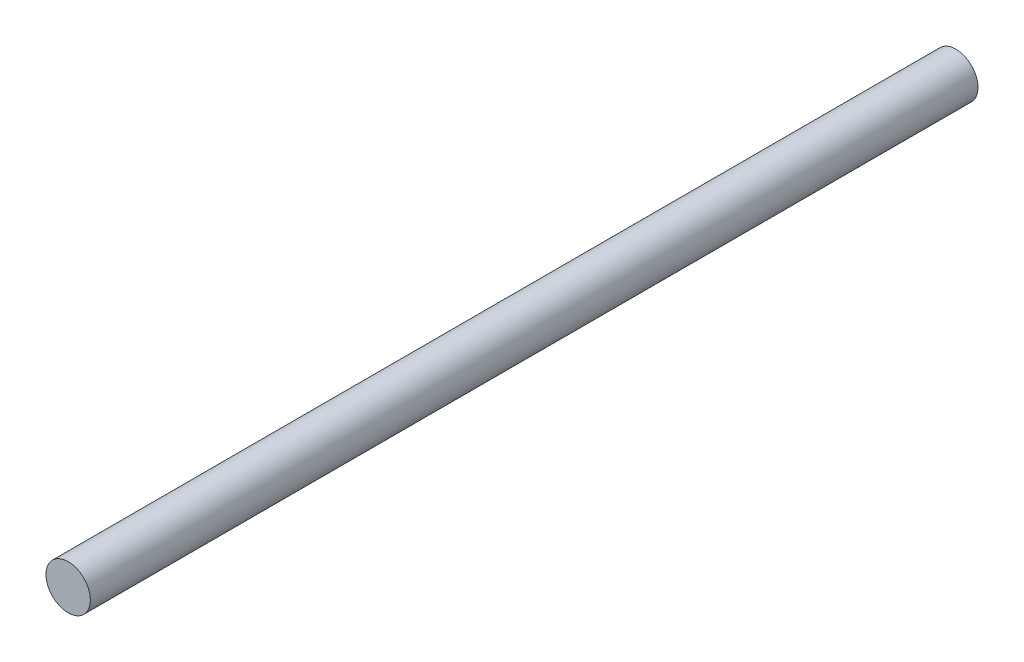
ISO-10303-21;
HEADER;
FILE_DESCRIPTION(('STEP AP214'),'2;1');
FILE_NAME('part.step','',(''),(''),'','','');
FILE_SCHEMA(('AUTOMOTIVE_DESIGN { 1 0 10303 214 1 1 1 1 }'));
ENDSEC;
DATA;
#1=APPLICATION_CONTEXT('core data for automotive mechanical design processes');
#2=APPLICATION_PROTOCOL_DEFINITION('international standard','automotive_design',2000,#1);
#3=PRODUCT_CONTEXT('',#1,'mechanical');
#4=PRODUCT('Part','Part','',(#3));
#5=PRODUCT_RELATED_PRODUCT_CATEGORY('part','',(#4));
#6=PRODUCT_DEFINITION_FORMATION('','',#4);
#7=PRODUCT_DEFINITION_CONTEXT('part definition',#1,'design');
#8=PRODUCT_DEFINITION('design','',#6,#7);
#9=PRODUCT_DEFINITION_SHAPE('','',#8);
#10=(LENGTH_UNIT() NAMED_UNIT(*) SI_UNIT(.MILLI.,.METRE.));
#11=(NAMED_UNIT(*) PLANE_ANGLE_UNIT() SI_UNIT($,.RADIAN.));
#12=(NAMED_UNIT(*) SI_UNIT($,.STERADIAN.) SOLID_ANGLE_UNIT());
#13=UNCERTAINTY_MEASURE_WITH_UNIT(LENGTH_MEASURE(1.E-05),#10,'distance_accuracy_value','');
#14=(GEOMETRIC_REPRESENTATION_CONTEXT(3) GLOBAL_UNCERTAINTY_ASSIGNED_CONTEXT((#13)) GLOBAL_UNIT_ASSIGNED_CONTEXT((#10,
#11,#12)) REPRESENTATION_CONTEXT('',''));
#15=CARTESIAN_POINT('',(0.,0.,0.));
#16=DIRECTION('',(0.,0.,1.));
#17=DIRECTION('',(1.,0.,0.));
#18=AXIS2_PLACEMENT_3D('',#15,#16,#17);
#19=CARTESIAN_POINT('',(0.,0.,300.));
#20=DIRECTION('',(0.,0.,-1.));
#21=DIRECTION('',(-1.,0.,0.));
#22=AXIS2_PLACEMENT_3D('',#19,#20,#21);
#23=CYLINDRICAL_SURFACE('',#22,7.50000000000001);
#24=CARTESIAN_POINT('',(0.,0.,300.));
#25=DIRECTION('',(0.,0.,1.));
#26=DIRECTION('',(1.,0.,0.));
#27=AXIS2_PLACEMENT_3D('',#24,#25,#26);
#28=CIRCLE('',#27,7.50000000000001);
#29=CARTESIAN_POINT('',(7.50000000000001,0.,300.));
#30=VERTEX_POINT('',#29);
#31=EDGE_CURVE('E10',#30,#30,#28,.T.);
#32=ORIENTED_EDGE('',*,*,#31,.F.);
#33=EDGE_LOOP('',(#32));
#34=FACE_BOUND('',#33,.T.);
#35=CARTESIAN_POINT('',(0.,0.,0.));
#36=DIRECTION('',(0.,0.,1.));
#37=DIRECTION('',(1.,0.,0.));
#38=AXIS2_PLACEMENT_3D('',#35,#36,#37);
#39=CIRCLE('',#38,7.50000000000001);
#40=CARTESIAN_POINT('',(7.50000000000001,0.,0.));
#41=VERTEX_POINT('',#40);
#42=EDGE_CURVE('E34',#41,#41,#39,.T.);
#43=ORIENTED_EDGE('',*,*,#42,.T.);
#44=EDGE_LOOP('',(#43));
#45=FACE_BOUND('',#44,.T.);
#46=ADVANCED_FACE('F31',(#34,#45),#23,.T.);
#47=CARTESIAN_POINT('',(0.,0.,300.));
#48=DIRECTION('',(0.,0.,1.));
#49=DIRECTION('',(1.,0.,0.));
#50=AXIS2_PLACEMENT_3D('',#47,#48,#49);
#51=PLANE('',#50);
#52=ORIENTED_EDGE('',*,*,#31,.T.);
#53=EDGE_LOOP('',(#52));
#54=FACE_BOUND('',#53,.T.);
#55=ADVANCED_FACE('F46',(#54),#51,.T.);
#56=CARTESIAN_POINT('',(0.,0.,0.));
#57=DIRECTION('',(0.,0.,1.));
#58=DIRECTION('',(1.,0.,0.));
#59=AXIS2_PLACEMENT_3D('',#56,#57,#58);
#60=PLANE('',#59);
#61=ORIENTED_EDGE('',*,*,#42,.F.);
#62=EDGE_LOOP('',(#61));
#63=FACE_BOUND('',#62,.T.);
#64=ADVANCED_FACE('F44',(#63),#60,.F.);
#65=CLOSED_SHELL('',(#46,#55,#64));
#66=MANIFOLD_SOLID_BREP('B2',#65);
#67=ADVANCED_BREP_SHAPE_REPRESENTATION('',(#18,#66),#14);
#68=SHAPE_DEFINITION_REPRESENTATION(#9,#67);
ENDSEC;
END-ISO-10303-21;
